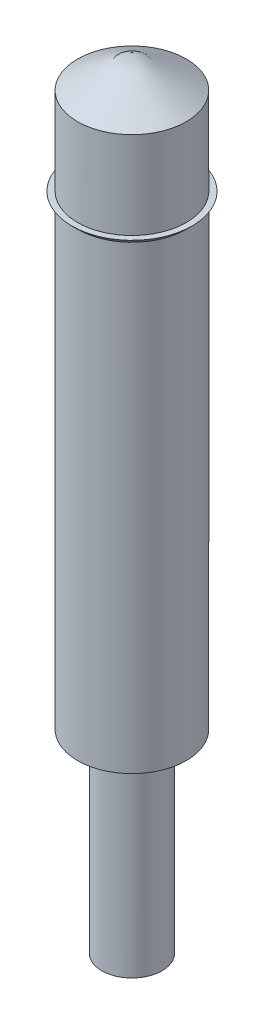
ISO-10303-21;
HEADER;
FILE_DESCRIPTION(('STEP AP214'),'2;1');
FILE_NAME('part.step','',(''),(''),'','','');
FILE_SCHEMA(('AUTOMOTIVE_DESIGN { 1 0 10303 214 1 1 1 1 }'));
ENDSEC;
DATA;
#1=APPLICATION_CONTEXT('core data for automotive mechanical design processes');
#2=APPLICATION_PROTOCOL_DEFINITION('international standard','automotive_design',2000,#1);
#3=PRODUCT_CONTEXT('',#1,'mechanical');
#4=PRODUCT('Part','Part','',(#3));
#5=PRODUCT_RELATED_PRODUCT_CATEGORY('part','',(#4));
#6=PRODUCT_DEFINITION_FORMATION('','',#4);
#7=PRODUCT_DEFINITION_CONTEXT('part definition',#1,'design');
#8=PRODUCT_DEFINITION('design','',#6,#7);
#9=PRODUCT_DEFINITION_SHAPE('','',#8);
#10=(LENGTH_UNIT() NAMED_UNIT(*) SI_UNIT(.MILLI.,.METRE.));
#11=(NAMED_UNIT(*) PLANE_ANGLE_UNIT() SI_UNIT($,.RADIAN.));
#12=(NAMED_UNIT(*) SI_UNIT($,.STERADIAN.) SOLID_ANGLE_UNIT());
#13=UNCERTAINTY_MEASURE_WITH_UNIT(LENGTH_MEASURE(1.E-05),#10,'distance_accuracy_value','');
#14=(GEOMETRIC_REPRESENTATION_CONTEXT(3) GLOBAL_UNCERTAINTY_ASSIGNED_CONTEXT((#13)) GLOBAL_UNIT_ASSIGNED_CONTEXT((#10,
#11,#12)) REPRESENTATION_CONTEXT('',''));
#15=CARTESIAN_POINT('',(0.,0.,0.));
#16=DIRECTION('',(0.,0.,1.));
#17=DIRECTION('',(1.,0.,0.));
#18=AXIS2_PLACEMENT_3D('',#15,#16,#17);
#19=CARTESIAN_POINT('',(0.,-93.9813339594928,-18.7));
#20=DIRECTION('',(0.,1.,0.));
#21=DIRECTION('',(0.,0.,1.));
#22=AXIS2_PLACEMENT_3D('',#19,#20,#21);
#23=CONICAL_SURFACE('',#22,0.,1.02974425867667);
#24=CARTESIAN_POINT('',(0.,-93.0500000000001,-18.7));
#25=DIRECTION('',(0.,-1.,0.));
#26=DIRECTION('',(0.,0.,-1.));
#27=AXIS2_PLACEMENT_3D('',#24,#25,#26);
#28=CIRCLE('',#27,1.55);
#29=CARTESIAN_POINT('',(0.,-93.0500000000001,-20.25));
#30=VERTEX_POINT('',#29);
#31=EDGE_CURVE('E78',#30,#30,#28,.T.);
#32=ORIENTED_EDGE('',*,*,#31,.T.);
#33=EDGE_LOOP('',(#32));
#34=FACE_BOUND('',#33,.T.);
#35=CARTESIAN_POINT('',(0.,-93.9813339594928,-18.7));
#36=VERTEX_POINT('',#35);
#37=VERTEX_LOOP('',#36);
#38=FACE_BOUND('',#37,.T.);
#39=ADVANCED_FACE('F17',(#34,#38),#23,.T.);
#40=CARTESIAN_POINT('',(0.,-52.8675902667229,-18.7));
#41=DIRECTION('',(0.,-1.,0.));
#42=DIRECTION('',(1.,0.,0.));
#43=AXIS2_PLACEMENT_3D('',#40,#41,#42);
#44=CONICAL_SURFACE('',#43,0.,1.02974425867664);
#45=CARTESIAN_POINT('',(0.,-54.5500000000001,-18.7));
#46=DIRECTION('',(0.,1.,0.));
#47=DIRECTION('',(-1.,0.,0.));
#48=AXIS2_PLACEMENT_3D('',#45,#46,#47);
#49=CIRCLE('',#48,2.8);
#50=CARTESIAN_POINT('',(-2.80000000000002,-54.5500000000001,-18.7));
#51=VERTEX_POINT('',#50);
#52=EDGE_CURVE('E74',#51,#51,#49,.T.);
#53=ORIENTED_EDGE('',*,*,#52,.T.);
#54=EDGE_LOOP('',(#53));
#55=FACE_BOUND('',#54,.T.);
#56=CARTESIAN_POINT('',(0.,-52.8675902667229,-18.7));
#57=VERTEX_POINT('',#56);
#58=VERTEX_LOOP('',#57);
#59=FACE_BOUND('',#58,.T.);
#60=ADVANCED_FACE('F34',(#55,#59),#44,.T.);
#61=CARTESIAN_POINT('',(0.,-93.0500000000001,-18.7));
#62=DIRECTION('',(0.,1.,0.));
#63=DIRECTION('',(0.,0.,1.));
#64=AXIS2_PLACEMENT_3D('',#61,#62,#63);
#65=CYLINDRICAL_SURFACE('',#64,1.55);
#66=CARTESIAN_POINT('',(0.,-83.8010757737845,-18.7));
#67=DIRECTION('',(0.,-1.,0.));
#68=DIRECTION('',(0.,0.,-1.));
#69=AXIS2_PLACEMENT_3D('',#66,#67,#68);
#70=CIRCLE('',#69,1.54999999999999);
#71=CARTESIAN_POINT('',(0.,-83.8010757737845,-20.25));
#72=VERTEX_POINT('',#71);
#73=EDGE_CURVE('E77',#72,#72,#70,.T.);
#74=ORIENTED_EDGE('',*,*,#73,.T.);
#75=EDGE_LOOP('',(#74));
#76=FACE_BOUND('',#75,.T.);
#77=ORIENTED_EDGE('',*,*,#31,.F.);
#78=EDGE_LOOP('',(#77));
#79=FACE_BOUND('',#78,.T.);
#80=ADVANCED_FACE('F41',(#76,#79),#65,.T.);
#81=CARTESIAN_POINT('',(0.,-54.5500000000001,-18.7));
#82=DIRECTION('',(0.,-1.,0.));
#83=DIRECTION('',(1.,0.,0.));
#84=AXIS2_PLACEMENT_3D('',#81,#82,#83);
#85=CYLINDRICAL_SURFACE('',#84,2.8);
#86=CARTESIAN_POINT('',(0.,-59.0500000000001,-18.7));
#87=DIRECTION('',(0.,-1.,0.));
#88=DIRECTION('',(1.,0.,0.));
#89=AXIS2_PLACEMENT_3D('',#86,#87,#88);
#90=CIRCLE('',#89,2.8);
#91=CARTESIAN_POINT('',(2.79999999999997,-59.0500000000001,-18.7));
#92=VERTEX_POINT('',#91);
#93=EDGE_CURVE('E21',#92,#92,#90,.F.);
#94=ORIENTED_EDGE('',*,*,#93,.T.);
#95=EDGE_LOOP('',(#94));
#96=FACE_BOUND('',#95,.T.);
#97=ORIENTED_EDGE('',*,*,#52,.F.);
#98=EDGE_LOOP('',(#97));
#99=FACE_BOUND('',#98,.T.);
#100=ADVANCED_FACE('F63',(#96,#99),#85,.T.);
#101=CARTESIAN_POINT('',(0.,-83.8010757737845,-18.7));
#102=DIRECTION('',(0.,1.,0.));
#103=DIRECTION('',(0.,0.,1.));
#104=AXIS2_PLACEMENT_3D('',#101,#102,#103);
#105=CONICAL_SURFACE('',#104,1.55,1.02974425867669);
#106=ORIENTED_EDGE('',*,*,#73,.F.);
#107=EDGE_LOOP('',(#106));
#108=FACE_BOUND('',#107,.T.);
#109=CARTESIAN_POINT('',(0.,-83.0500000000001,-18.7));
#110=DIRECTION('',(0.,-1.,0.));
#111=DIRECTION('',(0.,0.,-1.));
#112=AXIS2_PLACEMENT_3D('',#109,#110,#111);
#113=CIRCLE('',#112,2.8);
#114=CARTESIAN_POINT('',(0.,-83.0500000000001,-21.5));
#115=VERTEX_POINT('',#114);
#116=EDGE_CURVE('E70',#115,#115,#113,.T.);
#117=ORIENTED_EDGE('',*,*,#116,.T.);
#118=EDGE_LOOP('',(#117));
#119=FACE_BOUND('',#118,.T.);
#120=ADVANCED_FACE('F58',(#108,#119),#105,.T.);
#121=CARTESIAN_POINT('',(0.,-59.0500000000001,-24.7));
#122=DIRECTION('',(0.,-1.,0.));
#123=DIRECTION('',(0.,0.,-1.));
#124=AXIS2_PLACEMENT_3D('',#121,#122,#123);
#125=PLANE('',#124);
#126=ORIENTED_EDGE('',*,*,#93,.F.);
#127=EDGE_LOOP('',(#126));
#128=FACE_BOUND('',#127,.T.);
#129=CARTESIAN_POINT('',(0.,-59.0500000000001,-18.7));
#130=DIRECTION('',(0.,1.,0.));
#131=DIRECTION('',(0.,0.,1.));
#132=AXIS2_PLACEMENT_3D('',#129,#130,#131);
#133=CIRCLE('',#132,3.1);
#134=CARTESIAN_POINT('',(0.,-59.0500000000001,-15.6));
#135=VERTEX_POINT('',#134);
#136=EDGE_CURVE('E26',#135,#135,#133,.T.);
#137=ORIENTED_EDGE('',*,*,#136,.T.);
#138=EDGE_LOOP('',(#137));
#139=FACE_BOUND('',#138,.T.);
#140=ADVANCED_FACE('F53',(#128,#139),#125,.F.);
#141=CARTESIAN_POINT('',(0.,-83.0500000000001,-18.7));
#142=DIRECTION('',(0.,1.,0.));
#143=DIRECTION('',(0.,0.,1.));
#144=AXIS2_PLACEMENT_3D('',#141,#142,#143);
#145=CYLINDRICAL_SURFACE('',#144,2.8);
#146=ORIENTED_EDGE('',*,*,#116,.F.);
#147=EDGE_LOOP('',(#146));
#148=FACE_BOUND('',#147,.T.);
#149=CARTESIAN_POINT('',(0.,-59.3500000000001,-18.7));
#150=DIRECTION('',(0.,1.,0.));
#151=DIRECTION('',(0.,0.,1.));
#152=AXIS2_PLACEMENT_3D('',#149,#150,#151);
#153=CIRCLE('',#152,2.80000000000001);
#154=CARTESIAN_POINT('',(0.,-59.3500000000001,-15.9));
#155=VERTEX_POINT('',#154);
#156=EDGE_CURVE('E11',#155,#155,#153,.F.);
#157=ORIENTED_EDGE('',*,*,#156,.T.);
#158=EDGE_LOOP('',(#157));
#159=FACE_BOUND('',#158,.T.);
#160=ADVANCED_FACE('F19',(#148,#159),#145,.T.);
#161=CARTESIAN_POINT('',(0.,-59.3500000000001,-18.7));
#162=DIRECTION('',(0.,1.,0.));
#163=DIRECTION('',(0.,0.,1.));
#164=AXIS2_PLACEMENT_3D('',#161,#162,#163);
#165=CONICAL_SURFACE('',#164,2.8,0.78539816339746);
#166=ORIENTED_EDGE('',*,*,#156,.F.);
#167=EDGE_LOOP('',(#166));
#168=FACE_BOUND('',#167,.T.);
#169=ORIENTED_EDGE('',*,*,#136,.F.);
#170=EDGE_LOOP('',(#169));
#171=FACE_BOUND('',#170,.T.);
#172=ADVANCED_FACE('F46',(#168,#171),#165,.T.);
#173=CLOSED_SHELL('',(#39,#60,#80,#100,#120,#140,#160,#172));
#174=MANIFOLD_SOLID_BREP('B1',#173);
#175=ADVANCED_BREP_SHAPE_REPRESENTATION('',(#18,#174),#14);
#176=SHAPE_DEFINITION_REPRESENTATION(#9,#175);
ENDSEC;
END-ISO-10303-21;
